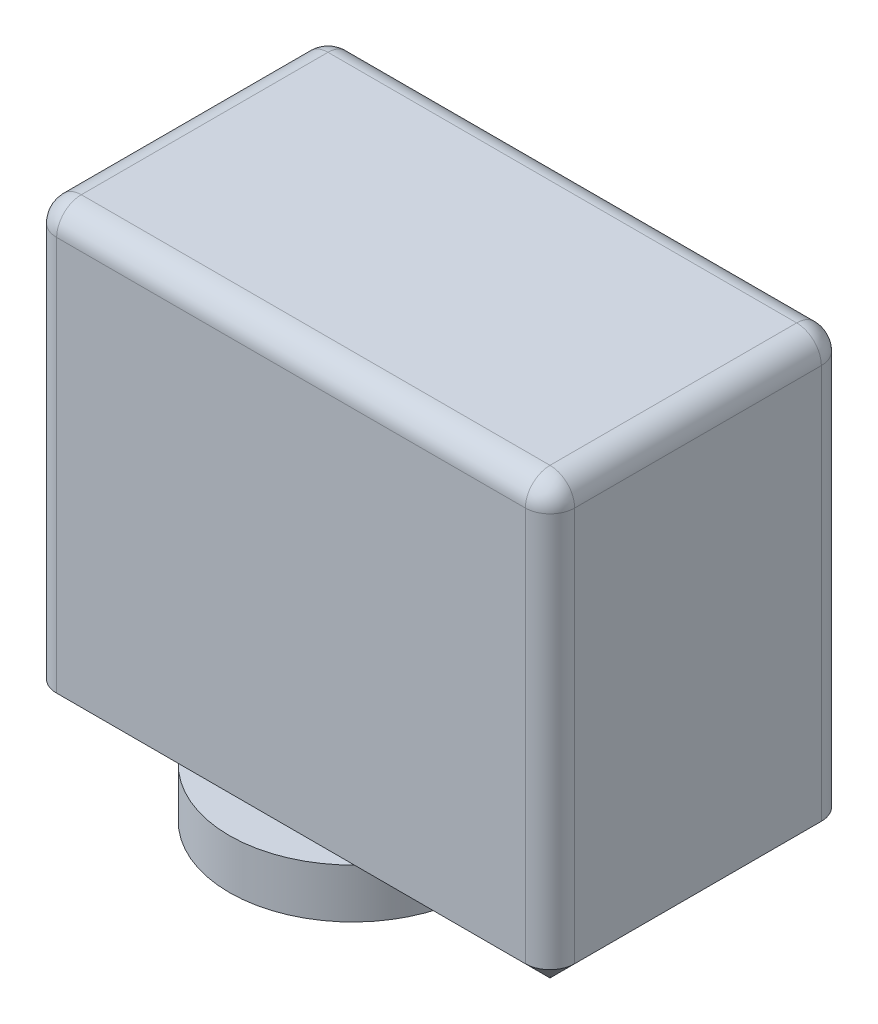
ISO-10303-21;
HEADER;
FILE_DESCRIPTION(('STEP AP214'),'2;1');
FILE_NAME('part.step','',(''),(''),'','','');
FILE_SCHEMA(('AUTOMOTIVE_DESIGN { 1 0 10303 214 1 1 1 1 }'));
ENDSEC;
DATA;
#1=APPLICATION_CONTEXT('core data for automotive mechanical design processes');
#2=APPLICATION_PROTOCOL_DEFINITION('international standard','automotive_design',2000,#1);
#3=PRODUCT_CONTEXT('',#1,'mechanical');
#4=PRODUCT('Part','Part','',(#3));
#5=PRODUCT_RELATED_PRODUCT_CATEGORY('part','',(#4));
#6=PRODUCT_DEFINITION_FORMATION('','',#4);
#7=PRODUCT_DEFINITION_CONTEXT('part definition',#1,'design');
#8=PRODUCT_DEFINITION('design','',#6,#7);
#9=PRODUCT_DEFINITION_SHAPE('','',#8);
#10=(LENGTH_UNIT() NAMED_UNIT(*) SI_UNIT(.MILLI.,.METRE.));
#11=(NAMED_UNIT(*) PLANE_ANGLE_UNIT() SI_UNIT($,.RADIAN.));
#12=(NAMED_UNIT(*) SI_UNIT($,.STERADIAN.) SOLID_ANGLE_UNIT());
#13=UNCERTAINTY_MEASURE_WITH_UNIT(LENGTH_MEASURE(1.E-05),#10,'distance_accuracy_value','');
#14=(GEOMETRIC_REPRESENTATION_CONTEXT(3) GLOBAL_UNCERTAINTY_ASSIGNED_CONTEXT((#13)) GLOBAL_UNIT_ASSIGNED_CONTEXT((#10,
#11,#12)) REPRESENTATION_CONTEXT('',''));
#15=CARTESIAN_POINT('',(0.,0.,0.));
#16=DIRECTION('',(0.,0.,1.));
#17=DIRECTION('',(1.,0.,0.));
#18=AXIS2_PLACEMENT_3D('',#15,#16,#17);
#19=CARTESIAN_POINT('',(-2.36981648973031,-5.11066723350098,0.));
#20=DIRECTION('',(0.,-1.,0.));
#21=DIRECTION('',(0.,0.,-1.));
#22=AXIS2_PLACEMENT_3D('',#19,#20,#21);
#23=CYLINDRICAL_SURFACE('',#22,8.51851851473251);
#24=CARTESIAN_POINT('',(-2.36981648973031,-5.11066723350098,0.));
#25=DIRECTION('',(0.,1.,0.));
#26=DIRECTION('',(0.,0.,1.));
#27=AXIS2_PLACEMENT_3D('',#24,#25,#26);
#28=CIRCLE('',#27,8.51851851473251);
#29=CARTESIAN_POINT('',(-2.36981648973031,-5.11066723350098,8.51851851473251));
#30=VERTEX_POINT('',#29);
#31=EDGE_CURVE('E566',#30,#30,#28,.T.);
#32=ORIENTED_EDGE('',*,*,#31,.F.);
#33=EDGE_LOOP('',(#32));
#34=FACE_BOUND('',#33,.T.);
#35=CARTESIAN_POINT('',(-2.36981648973031,-8.51807463939398,0.));
#36=DIRECTION('',(0.,1.,0.));
#37=DIRECTION('',(0.,0.,1.));
#38=AXIS2_PLACEMENT_3D('',#35,#36,#37);
#39=CIRCLE('',#38,8.51851851473251);
#40=CARTESIAN_POINT('',(-2.36981648973031,-8.51807463939398,8.51851851473251));
#41=VERTEX_POINT('',#40);
#42=EDGE_CURVE('E565',#41,#41,#39,.T.);
#43=ORIENTED_EDGE('',*,*,#42,.T.);
#44=EDGE_LOOP('',(#43));
#45=FACE_BOUND('',#44,.T.);
#46=ADVANCED_FACE('F40',(#34,#45),#23,.T.);
#47=CARTESIAN_POINT('',(-2.36981648973031,-5.11066723350098,0.));
#48=DIRECTION('',(0.,1.,0.));
#49=DIRECTION('',(0.,0.,1.));
#50=AXIS2_PLACEMENT_3D('',#47,#48,#49);
#51=PLANE('',#50);
#52=CARTESIAN_POINT('',(-2.36981648973031,-5.11066723350098,0.));
#53=DIRECTION('',(0.,1.,0.));
#54=DIRECTION('',(0.,0.,1.));
#55=AXIS2_PLACEMENT_3D('',#52,#53,#54);
#56=CIRCLE('',#55,3.407407405893);
#57=CARTESIAN_POINT('',(-2.36981648973031,-5.11066723350098,3.407407405893));
#58=VERTEX_POINT('',#57);
#59=EDGE_CURVE('E161',#58,#58,#56,.T.);
#60=ORIENTED_EDGE('',*,*,#59,.F.);
#61=EDGE_LOOP('',(#60));
#62=FACE_BOUND('',#61,.T.);
#63=ORIENTED_EDGE('',*,*,#31,.T.);
#64=EDGE_LOOP('',(#63));
#65=FACE_BOUND('',#64,.T.);
#66=ADVANCED_FACE('F320',(#62,#65),#51,.T.);
#67=CARTESIAN_POINT('',(-2.36981648973031,-8.51807463939398,0.));
#68=DIRECTION('',(0.,1.,0.));
#69=DIRECTION('',(0.,0.,1.));
#70=AXIS2_PLACEMENT_3D('',#67,#68,#69);
#71=PLANE('',#70);
#72=ORIENTED_EDGE('',*,*,#42,.F.);
#73=EDGE_LOOP('',(#72));
#74=FACE_BOUND('',#73,.T.);
#75=ADVANCED_FACE('F326',(#74),#71,.F.);
#76=CARTESIAN_POINT('',(-2.36981648973031,-2.55511167908123,0.));
#77=DIRECTION('',(0.,-1.,0.));
#78=DIRECTION('',(0.,0.,-1.));
#79=AXIS2_PLACEMENT_3D('',#76,#77,#78);
#80=CYLINDRICAL_SURFACE('',#79,3.407407405893);
#81=CARTESIAN_POINT('',(-2.36981648973031,-2.55511167908123,0.));
#82=DIRECTION('',(0.,1.,0.));
#83=DIRECTION('',(0.,0.,1.));
#84=AXIS2_PLACEMENT_3D('',#81,#82,#83);
#85=CIRCLE('',#84,3.407407405893);
#86=CARTESIAN_POINT('',(-2.36981648973031,-2.55511167908123,3.407407405893));
#87=VERTEX_POINT('',#86);
#88=EDGE_CURVE('E221',#87,#87,#85,.T.);
#89=ORIENTED_EDGE('',*,*,#88,.F.);
#90=EDGE_LOOP('',(#89));
#91=FACE_BOUND('',#90,.T.);
#92=ORIENTED_EDGE('',*,*,#59,.T.);
#93=EDGE_LOOP('',(#92));
#94=FACE_BOUND('',#93,.T.);
#95=ADVANCED_FACE('F532',(#91,#94),#80,.T.);
#96=CARTESIAN_POINT('',(21.4820353515207,28.1115549739558,10.222222217679));
#97=DIRECTION('',(-1.,0.,0.));
#98=DIRECTION('',(0.,0.,1.));
#99=AXIS2_PLACEMENT_3D('',#96,#97,#98);
#100=PLANE('',#99);
#101=DIRECTION('',(0.,-1.,0.));
#102=VECTOR('',#101,1.);
#103=CARTESIAN_POINT('',(21.4820353515207,28.1115549739558,8.51851851473251));
#104=LINE('',#103,#102);
#105=CARTESIAN_POINT('',(21.4820353515207,26.4078512710093,8.51851851473251));
#106=VERTEX_POINT('',#105);
#107=CARTESIAN_POINT('',(21.4820353515207,-0.851407976134718,8.51851851473251));
#108=VERTEX_POINT('',#107);
#109=EDGE_CURVE('E187',#106,#108,#104,.T.);
#110=ORIENTED_EDGE('',*,*,#109,.T.);
#111=DIRECTION('',(0.,0.,-1.));
#112=VECTOR('',#111,1.);
#113=CARTESIAN_POINT('',(21.4820353515207,-0.851407976134718,10.222222217679));
#114=LINE('',#113,#112);
#115=CARTESIAN_POINT('',(21.4820353515207,-0.851407976134718,-8.51851851473251));
#116=VERTEX_POINT('',#115);
#117=EDGE_CURVE('E237',#108,#116,#114,.T.);
#118=ORIENTED_EDGE('',*,*,#117,.T.);
#119=DIRECTION('',(0.,-1.,0.));
#120=VECTOR('',#119,1.);
#121=CARTESIAN_POINT('',(21.4820353515207,28.1115549739558,-8.51851851473251));
#122=LINE('',#121,#120);
#123=CARTESIAN_POINT('',(21.4820353515207,26.4078512710093,-8.51851851473251));
#124=VERTEX_POINT('',#123);
#125=EDGE_CURVE('E183',#116,#124,#122,.F.);
#126=ORIENTED_EDGE('',*,*,#125,.T.);
#127=DIRECTION('',(0.,0.,-1.));
#128=VECTOR('',#127,1.);
#129=CARTESIAN_POINT('',(21.4820353515207,26.4078512710093,10.222222217679));
#130=LINE('',#129,#128);
#131=EDGE_CURVE('E185',#124,#106,#130,.F.);
#132=ORIENTED_EDGE('',*,*,#131,.T.);
#133=EDGE_LOOP('',(#110,#118,#126,#132));
#134=FACE_BOUND('',#133,.T.);
#135=ADVANCED_FACE('F306',(#134),#100,.F.);
#136=CARTESIAN_POINT('',(-2.36981648973031,28.1115549739558,-10.222222217679));
#137=DIRECTION('',(0.,0.,1.));
#138=DIRECTION('',(1.,0.,0.));
#139=AXIS2_PLACEMENT_3D('',#136,#137,#138);
#140=PLANE('',#139);
#141=DIRECTION('',(0.,-1.,0.));
#142=VECTOR('',#141,1.);
#143=CARTESIAN_POINT('',(19.7783316485742,28.1115549739558,-10.222222217679));
#144=LINE('',#143,#142);
#145=CARTESIAN_POINT('',(19.7783316485742,26.4078512710093,-10.222222217679));
#146=VERTEX_POINT('',#145);
#147=CARTESIAN_POINT('',(19.7783316485742,-0.851407976134718,-10.222222217679));
#148=VERTEX_POINT('',#147);
#149=EDGE_CURVE('E181',#146,#148,#144,.T.);
#150=ORIENTED_EDGE('',*,*,#149,.T.);
#151=DIRECTION('',(-1.,0.,0.));
#152=VECTOR('',#151,1.);
#153=CARTESIAN_POINT('',(-2.36981648973031,-0.851407976134718,-10.222222217679));
#154=LINE('',#153,#152);
#155=CARTESIAN_POINT('',(-12.5920387074093,-0.851407976134718,-10.222222217679));
#156=VERTEX_POINT('',#155);
#157=EDGE_CURVE('E11',#148,#156,#154,.T.);
#158=ORIENTED_EDGE('',*,*,#157,.T.);
#159=DIRECTION('',(0.,-1.,0.));
#160=VECTOR('',#159,1.);
#161=CARTESIAN_POINT('',(-12.5920387074093,28.1115549739558,-10.222222217679));
#162=LINE('',#161,#160);
#163=CARTESIAN_POINT('',(-12.5920387074093,26.4078512710093,-10.222222217679));
#164=VERTEX_POINT('',#163);
#165=EDGE_CURVE('E177',#156,#164,#162,.F.);
#166=ORIENTED_EDGE('',*,*,#165,.T.);
#167=DIRECTION('',(-1.,0.,0.));
#168=VECTOR('',#167,1.);
#169=CARTESIAN_POINT('',(21.4820353515207,26.4078512710093,-10.222222217679));
#170=LINE('',#169,#168);
#171=EDGE_CURVE('E179',#164,#146,#170,.F.);
#172=ORIENTED_EDGE('',*,*,#171,.T.);
#173=EDGE_LOOP('',(#150,#158,#166,#172));
#174=FACE_BOUND('',#173,.T.);
#175=ADVANCED_FACE('F514',(#174),#140,.F.);
#176=CARTESIAN_POINT('',(-14.2957424103558,28.1115549739558,-10.222222217679));
#177=DIRECTION('',(1.,0.,0.));
#178=DIRECTION('',(0.,0.,-1.));
#179=AXIS2_PLACEMENT_3D('',#176,#177,#178);
#180=PLANE('',#179);
#181=DIRECTION('',(0.,-1.,0.));
#182=VECTOR('',#181,1.);
#183=CARTESIAN_POINT('',(-14.2957424103558,28.1115549739558,-8.51851851473251));
#184=LINE('',#183,#182);
#185=CARTESIAN_POINT('',(-14.2957424103558,26.4078512710093,-8.51851851473251));
#186=VERTEX_POINT('',#185);
#187=CARTESIAN_POINT('',(-14.2957424103558,-0.851407976134718,-8.51851851473251));
#188=VERTEX_POINT('',#187);
#189=EDGE_CURVE('E167',#186,#188,#184,.T.);
#190=ORIENTED_EDGE('',*,*,#189,.T.);
#191=DIRECTION('',(0.,0.,1.));
#192=VECTOR('',#191,1.);
#193=CARTESIAN_POINT('',(-14.2957424103558,-0.851407976134718,-10.222222217679));
#194=LINE('',#193,#192);
#195=CARTESIAN_POINT('',(-14.2957424103558,-0.851407976134718,8.51851851473251));
#196=VERTEX_POINT('',#195);
#197=EDGE_CURVE('E239',#188,#196,#194,.T.);
#198=ORIENTED_EDGE('',*,*,#197,.T.);
#199=DIRECTION('',(0.,-1.,0.));
#200=VECTOR('',#199,1.);
#201=CARTESIAN_POINT('',(-14.2957424103558,28.1115549739558,8.51851851473251));
#202=LINE('',#201,#200);
#203=CARTESIAN_POINT('',(-14.2957424103558,26.4078512710093,8.51851851473251));
#204=VERTEX_POINT('',#203);
#205=EDGE_CURVE('E175',#196,#204,#202,.F.);
#206=ORIENTED_EDGE('',*,*,#205,.T.);
#207=DIRECTION('',(0.,0.,1.));
#208=VECTOR('',#207,1.);
#209=CARTESIAN_POINT('',(-14.2957424103558,26.4078512710093,-10.222222217679));
#210=LINE('',#209,#208);
#211=EDGE_CURVE('E138',#204,#186,#210,.F.);
#212=ORIENTED_EDGE('',*,*,#211,.T.);
#213=EDGE_LOOP('',(#190,#198,#206,#212));
#214=FACE_BOUND('',#213,.T.);
#215=ADVANCED_FACE('F279',(#214),#180,.F.);
#216=CARTESIAN_POINT('',(-2.36981648973031,28.1115549739558,10.222222217679));
#217=DIRECTION('',(0.,0.,-1.));
#218=DIRECTION('',(-1.,0.,0.));
#219=AXIS2_PLACEMENT_3D('',#216,#217,#218);
#220=PLANE('',#219);
#221=DIRECTION('',(0.,-1.,0.));
#222=VECTOR('',#221,1.);
#223=CARTESIAN_POINT('',(-12.5920387074093,28.1115549739558,10.222222217679));
#224=LINE('',#223,#222);
#225=CARTESIAN_POINT('',(-12.5920387074093,26.4078512710093,10.222222217679));
#226=VERTEX_POINT('',#225);
#227=CARTESIAN_POINT('',(-12.5920387074093,-0.851407976134718,10.222222217679));
#228=VERTEX_POINT('',#227);
#229=EDGE_CURVE('E190',#226,#228,#224,.T.);
#230=ORIENTED_EDGE('',*,*,#229,.T.);
#231=DIRECTION('',(1.,0.,0.));
#232=VECTOR('',#231,1.);
#233=CARTESIAN_POINT('',(-2.36981648973031,-0.851407976134718,10.222222217679));
#234=LINE('',#233,#232);
#235=CARTESIAN_POINT('',(19.7783316485742,-0.851407976134718,10.222222217679));
#236=VERTEX_POINT('',#235);
#237=EDGE_CURVE('E196',#228,#236,#234,.T.);
#238=ORIENTED_EDGE('',*,*,#237,.T.);
#239=DIRECTION('',(0.,-1.,0.));
#240=VECTOR('',#239,1.);
#241=CARTESIAN_POINT('',(19.7783316485742,28.1115549739558,10.222222217679));
#242=LINE('',#241,#240);
#243=CARTESIAN_POINT('',(19.7783316485742,26.4078512710093,10.222222217679));
#244=VERTEX_POINT('',#243);
#245=EDGE_CURVE('E195',#236,#244,#242,.F.);
#246=ORIENTED_EDGE('',*,*,#245,.T.);
#247=DIRECTION('',(1.,0.,0.));
#248=VECTOR('',#247,1.);
#249=CARTESIAN_POINT('',(-14.2957424103558,26.4078512710093,10.222222217679));
#250=LINE('',#249,#248);
#251=EDGE_CURVE('E193',#244,#226,#250,.F.);
#252=ORIENTED_EDGE('',*,*,#251,.T.);
#253=EDGE_LOOP('',(#230,#238,#246,#252));
#254=FACE_BOUND('',#253,.T.);
#255=ADVANCED_FACE('F286',(#254),#220,.F.);
#256=CARTESIAN_POINT('',(-2.36981648973031,28.1115549739558,0.));
#257=DIRECTION('',(0.,1.,0.));
#258=DIRECTION('',(0.,0.,1.));
#259=AXIS2_PLACEMENT_3D('',#256,#257,#258);
#260=PLANE('',#259);
#261=DIRECTION('',(-1.,0.,0.));
#262=VECTOR('',#261,1.);
#263=CARTESIAN_POINT('',(-14.2957424103558,28.1115549739558,-8.51851851473251));
#264=LINE('',#263,#262);
#265=CARTESIAN_POINT('',(19.7783316485742,28.1115549739558,-8.51851851473251));
#266=VERTEX_POINT('',#265);
#267=CARTESIAN_POINT('',(-12.5920387074093,28.1115549739558,-8.51851851473251));
#268=VERTEX_POINT('',#267);
#269=EDGE_CURVE('E165',#266,#268,#264,.T.);
#270=ORIENTED_EDGE('',*,*,#269,.T.);
#271=DIRECTION('',(0.,0.,1.));
#272=VECTOR('',#271,1.);
#273=CARTESIAN_POINT('',(-12.5920387074093,28.1115549739558,10.222222217679));
#274=LINE('',#273,#272);
#275=CARTESIAN_POINT('',(-12.5920387074093,28.1115549739558,8.51851851473251));
#276=VERTEX_POINT('',#275);
#277=EDGE_CURVE('E136',#268,#276,#274,.T.);
#278=ORIENTED_EDGE('',*,*,#277,.T.);
#279=DIRECTION('',(1.,0.,0.));
#280=VECTOR('',#279,1.);
#281=CARTESIAN_POINT('',(21.4820353515207,28.1115549739558,8.51851851473251));
#282=LINE('',#281,#280);
#283=CARTESIAN_POINT('',(19.7783316485742,28.1115549739558,8.51851851473251));
#284=VERTEX_POINT('',#283);
#285=EDGE_CURVE('E154',#276,#284,#282,.T.);
#286=ORIENTED_EDGE('',*,*,#285,.T.);
#287=DIRECTION('',(0.,0.,-1.));
#288=VECTOR('',#287,1.);
#289=CARTESIAN_POINT('',(19.7783316485742,28.1115549739558,-10.222222217679));
#290=LINE('',#289,#288);
#291=EDGE_CURVE('E160',#284,#266,#290,.T.);
#292=ORIENTED_EDGE('',*,*,#291,.T.);
#293=EDGE_LOOP('',(#270,#278,#286,#292));
#294=FACE_BOUND('',#293,.T.);
#295=ADVANCED_FACE('F163',(#294),#260,.T.);
#296=CARTESIAN_POINT('',(-2.36981648973031,-2.55511167908123,0.));
#297=DIRECTION('',(0.,1.,0.));
#298=DIRECTION('',(0.,0.,1.));
#299=AXIS2_PLACEMENT_3D('',#296,#297,#298);
#300=PLANE('',#299);
#301=DIRECTION('',(0.,0.,1.));
#302=VECTOR('',#301,1.);
#303=CARTESIAN_POINT('',(19.7783316485742,-2.55511167908123,0.));
#304=LINE('',#303,#302);
#305=CARTESIAN_POINT('',(19.7783316485742,-2.55511167908123,-8.51851851473249));
#306=VERTEX_POINT('',#305);
#307=CARTESIAN_POINT('',(19.7783316485742,-2.55511167908123,8.51851851473251));
#308=VERTEX_POINT('',#307);
#309=EDGE_CURVE('E228',#306,#308,#304,.T.);
#310=ORIENTED_EDGE('',*,*,#309,.T.);
#311=DIRECTION('',(-1.,0.,0.));
#312=VECTOR('',#311,1.);
#313=CARTESIAN_POINT('',(-2.36981648973031,-2.55511167908123,8.51851851473249));
#314=LINE('',#313,#312);
#315=CARTESIAN_POINT('',(-12.5920387074093,-2.55511167908123,8.51851851473251));
#316=VERTEX_POINT('',#315);
#317=EDGE_CURVE('E230',#308,#316,#314,.T.);
#318=ORIENTED_EDGE('',*,*,#317,.T.);
#319=DIRECTION('',(0.,0.,-1.));
#320=VECTOR('',#319,1.);
#321=CARTESIAN_POINT('',(-12.5920387074093,-2.55511167908123,0.));
#322=LINE('',#321,#320);
#323=CARTESIAN_POINT('',(-12.5920387074093,-2.55511167908123,-8.51851851473249));
#324=VERTEX_POINT('',#323);
#325=EDGE_CURVE('E226',#316,#324,#322,.T.);
#326=ORIENTED_EDGE('',*,*,#325,.T.);
#327=DIRECTION('',(1.,0.,0.));
#328=VECTOR('',#327,1.);
#329=CARTESIAN_POINT('',(-2.36981648973031,-2.55511167908123,-8.51851851473249));
#330=LINE('',#329,#328);
#331=EDGE_CURVE('E224',#324,#306,#330,.T.);
#332=ORIENTED_EDGE('',*,*,#331,.T.);
#333=EDGE_LOOP('',(#310,#318,#326,#332));
#334=FACE_BOUND('',#333,.T.);
#335=ORIENTED_EDGE('',*,*,#88,.T.);
#336=EDGE_LOOP('',(#335));
#337=FACE_BOUND('',#336,.T.);
#338=ADVANCED_FACE('F370',(#334,#337),#300,.F.);
#339=CARTESIAN_POINT('',(19.7783316485742,28.1115549739558,-8.51851851473251));
#340=DIRECTION('',(0.,-1.,0.));
#341=DIRECTION('',(0.,0.,-1.));
#342=AXIS2_PLACEMENT_3D('',#339,#340,#341);
#343=CYLINDRICAL_SURFACE('',#342,1.7037037029465);
#344=ORIENTED_EDGE('',*,*,#125,.F.);
#345=CARTESIAN_POINT('',(19.7783316485742,-0.851407976134718,-8.51851851473251));
#346=DIRECTION('',(0.,1.,0.));
#347=DIRECTION('',(0.,0.,1.));
#348=AXIS2_PLACEMENT_3D('',#345,#346,#347);
#349=CIRCLE('',#348,1.7037037029465);
#350=EDGE_CURVE('E63',#116,#148,#349,.T.);
#351=ORIENTED_EDGE('',*,*,#350,.T.);
#352=ORIENTED_EDGE('',*,*,#149,.F.);
#353=CARTESIAN_POINT('',(19.7783316485742,26.4078512710093,-8.51851851473251));
#354=DIRECTION('',(0.,1.,0.));
#355=DIRECTION('',(0.,0.,1.));
#356=AXIS2_PLACEMENT_3D('',#353,#354,#355);
#357=CIRCLE('',#356,1.7037037029465);
#358=EDGE_CURVE('E218',#124,#146,#357,.T.);
#359=ORIENTED_EDGE('',*,*,#358,.F.);
#360=EDGE_LOOP('',(#344,#351,#352,#359));
#361=FACE_BOUND('',#360,.T.);
#362=ADVANCED_FACE('F366',(#361),#343,.T.);
#363=CARTESIAN_POINT('',(19.7783316485742,26.4078512710093,0.));
#364=DIRECTION('',(0.,0.,1.));
#365=DIRECTION('',(1.,0.,0.));
#366=AXIS2_PLACEMENT_3D('',#363,#364,#365);
#367=CYLINDRICAL_SURFACE('',#366,1.7037037029465);
#368=CARTESIAN_POINT('',(19.7783316485742,26.4078512710093,8.51851851473251));
#369=DIRECTION('',(0.,0.,1.));
#370=DIRECTION('',(1.,0.,0.));
#371=AXIS2_PLACEMENT_3D('',#368,#369,#370);
#372=CIRCLE('',#371,1.7037037029465);
#373=EDGE_CURVE('E212',#106,#284,#372,.T.);
#374=ORIENTED_EDGE('',*,*,#373,.F.);
#375=ORIENTED_EDGE('',*,*,#131,.F.);
#376=CARTESIAN_POINT('',(19.7783316485742,26.4078512710093,-8.51851851473251));
#377=DIRECTION('',(0.,0.,-1.));
#378=DIRECTION('',(-1.,0.,0.));
#379=AXIS2_PLACEMENT_3D('',#376,#377,#378);
#380=CIRCLE('',#379,1.7037037029465);
#381=EDGE_CURVE('E215',#266,#124,#380,.T.);
#382=ORIENTED_EDGE('',*,*,#381,.F.);
#383=ORIENTED_EDGE('',*,*,#291,.F.);
#384=EDGE_LOOP('',(#374,#375,#382,#383));
#385=FACE_BOUND('',#384,.T.);
#386=ADVANCED_FACE('F363',(#385),#367,.T.);
#387=CARTESIAN_POINT('',(19.7783316485742,28.1115549739558,8.51851851473251));
#388=DIRECTION('',(0.,-1.,0.));
#389=DIRECTION('',(0.,0.,-1.));
#390=AXIS2_PLACEMENT_3D('',#387,#388,#389);
#391=CYLINDRICAL_SURFACE('',#390,1.7037037029465);
#392=ORIENTED_EDGE('',*,*,#245,.F.);
#393=CARTESIAN_POINT('',(19.7783316485742,-0.851407976134718,8.51851851473251));
#394=DIRECTION('',(0.,1.,0.));
#395=DIRECTION('',(0.,0.,1.));
#396=AXIS2_PLACEMENT_3D('',#393,#394,#395);
#397=CIRCLE('',#396,1.7037037029465);
#398=EDGE_CURVE('E233',#236,#108,#397,.T.);
#399=ORIENTED_EDGE('',*,*,#398,.T.);
#400=ORIENTED_EDGE('',*,*,#109,.F.);
#401=CARTESIAN_POINT('',(19.7783316485742,26.4078512710093,8.51851851473251));
#402=DIRECTION('',(0.,1.,0.));
#403=DIRECTION('',(0.,0.,1.));
#404=AXIS2_PLACEMENT_3D('',#401,#402,#403);
#405=CIRCLE('',#404,1.7037037029465);
#406=EDGE_CURVE('E209',#244,#106,#405,.T.);
#407=ORIENTED_EDGE('',*,*,#406,.F.);
#408=EDGE_LOOP('',(#392,#399,#400,#407));
#409=FACE_BOUND('',#408,.T.);
#410=ADVANCED_FACE('F301',(#409),#391,.T.);
#411=CARTESIAN_POINT('',(19.7783316485742,26.4078512710093,-8.51851851473251));
#412=DIRECTION('',(0.,0.,1.));
#413=DIRECTION('',(1.,0.,0.));
#414=AXIS2_PLACEMENT_3D('',#411,#412,#413);
#415=SPHERICAL_SURFACE('',#414,1.7037037029465);
#416=ORIENTED_EDGE('',*,*,#381,.T.);
#417=ORIENTED_EDGE('',*,*,#358,.T.);
#418=CARTESIAN_POINT('',(19.7783316485742,26.4078512710093,-8.51851851473251));
#419=DIRECTION('',(1.,0.,0.));
#420=DIRECTION('',(0.,0.,-1.));
#421=AXIS2_PLACEMENT_3D('',#418,#419,#420);
#422=CIRCLE('',#421,1.7037037029465);
#423=EDGE_CURVE('E206',#266,#146,#422,.F.);
#424=ORIENTED_EDGE('',*,*,#423,.F.);
#425=EDGE_LOOP('',(#416,#417,#424));
#426=FACE_BOUND('',#425,.T.);
#427=ADVANCED_FACE('F356',(#426),#415,.T.);
#428=CARTESIAN_POINT('',(19.7783316485742,26.4078512710093,8.51851851473251));
#429=DIRECTION('',(0.,0.,1.));
#430=DIRECTION('',(1.,0.,0.));
#431=AXIS2_PLACEMENT_3D('',#428,#429,#430);
#432=SPHERICAL_SURFACE('',#431,1.7037037029465);
#433=ORIENTED_EDGE('',*,*,#406,.T.);
#434=ORIENTED_EDGE('',*,*,#373,.T.);
#435=CARTESIAN_POINT('',(19.7783316485742,26.4078512710093,8.51851851473251));
#436=DIRECTION('',(1.,0.,0.));
#437=DIRECTION('',(0.,0.,-1.));
#438=AXIS2_PLACEMENT_3D('',#435,#436,#437);
#439=CIRCLE('',#438,1.7037037029465);
#440=EDGE_CURVE('E157',#244,#284,#439,.F.);
#441=ORIENTED_EDGE('',*,*,#440,.F.);
#442=EDGE_LOOP('',(#433,#434,#441));
#443=FACE_BOUND('',#442,.T.);
#444=ADVANCED_FACE('F352',(#443),#432,.T.);
#445=CARTESIAN_POINT('',(-12.5920387074093,28.1115549739558,-8.51851851473251));
#446=DIRECTION('',(0.,-1.,0.));
#447=DIRECTION('',(0.,0.,-1.));
#448=AXIS2_PLACEMENT_3D('',#445,#446,#447);
#449=CYLINDRICAL_SURFACE('',#448,1.7037037029465);
#450=ORIENTED_EDGE('',*,*,#165,.F.);
#451=CARTESIAN_POINT('',(-12.5920387074093,-0.851407976134718,-8.51851851473251));
#452=DIRECTION('',(0.,1.,0.));
#453=DIRECTION('',(0.,0.,1.));
#454=AXIS2_PLACEMENT_3D('',#451,#452,#453);
#455=CIRCLE('',#454,1.7037037029465);
#456=EDGE_CURVE('E49',#156,#188,#455,.T.);
#457=ORIENTED_EDGE('',*,*,#456,.T.);
#458=ORIENTED_EDGE('',*,*,#189,.F.);
#459=CARTESIAN_POINT('',(-12.5920387074093,26.4078512710093,-8.51851851473251));
#460=DIRECTION('',(0.,1.,0.));
#461=DIRECTION('',(0.,0.,1.));
#462=AXIS2_PLACEMENT_3D('',#459,#460,#461);
#463=CIRCLE('',#462,1.7037037029465);
#464=EDGE_CURVE('E202',#164,#186,#463,.T.);
#465=ORIENTED_EDGE('',*,*,#464,.F.);
#466=EDGE_LOOP('',(#450,#457,#458,#465));
#467=FACE_BOUND('',#466,.T.);
#468=ADVANCED_FACE('F348',(#467),#449,.T.);
#469=CARTESIAN_POINT('',(-2.36981648973031,26.4078512710093,-8.51851851473251));
#470=DIRECTION('',(1.,0.,0.));
#471=DIRECTION('',(0.,0.,-1.));
#472=AXIS2_PLACEMENT_3D('',#469,#470,#471);
#473=CYLINDRICAL_SURFACE('',#472,1.7037037029465);
#474=ORIENTED_EDGE('',*,*,#423,.T.);
#475=ORIENTED_EDGE('',*,*,#171,.F.);
#476=CARTESIAN_POINT('',(-12.5920387074093,26.4078512710093,-8.51851851473251));
#477=DIRECTION('',(-1.,0.,0.));
#478=DIRECTION('',(0.,0.,1.));
#479=AXIS2_PLACEMENT_3D('',#476,#477,#478);
#480=CIRCLE('',#479,1.7037037029465);
#481=EDGE_CURVE('E151',#268,#164,#480,.T.);
#482=ORIENTED_EDGE('',*,*,#481,.F.);
#483=ORIENTED_EDGE('',*,*,#269,.F.);
#484=EDGE_LOOP('',(#474,#475,#482,#483));
#485=FACE_BOUND('',#484,.T.);
#486=ADVANCED_FACE('F345',(#485),#473,.T.);
#487=CARTESIAN_POINT('',(-2.36981648973031,26.4078512710093,8.51851851473251));
#488=DIRECTION('',(-1.,0.,0.));
#489=DIRECTION('',(0.,0.,1.));
#490=AXIS2_PLACEMENT_3D('',#487,#488,#489);
#491=CYLINDRICAL_SURFACE('',#490,1.7037037029465);
#492=ORIENTED_EDGE('',*,*,#440,.T.);
#493=ORIENTED_EDGE('',*,*,#285,.F.);
#494=CARTESIAN_POINT('',(-12.5920387074093,26.4078512710093,8.51851851473251));
#495=DIRECTION('',(-1.,0.,0.));
#496=DIRECTION('',(0.,0.,1.));
#497=AXIS2_PLACEMENT_3D('',#494,#495,#496);
#498=CIRCLE('',#497,1.7037037029465);
#499=EDGE_CURVE('E144',#226,#276,#498,.T.);
#500=ORIENTED_EDGE('',*,*,#499,.F.);
#501=ORIENTED_EDGE('',*,*,#251,.F.);
#502=EDGE_LOOP('',(#492,#493,#500,#501));
#503=FACE_BOUND('',#502,.T.);
#504=ADVANCED_FACE('F155',(#503),#491,.T.);
#505=CARTESIAN_POINT('',(-12.5920387074093,28.1115549739558,8.51851851473251));
#506=DIRECTION('',(0.,-1.,0.));
#507=DIRECTION('',(0.,0.,-1.));
#508=AXIS2_PLACEMENT_3D('',#505,#506,#507);
#509=CYLINDRICAL_SURFACE('',#508,1.7037037029465);
#510=ORIENTED_EDGE('',*,*,#205,.F.);
#511=CARTESIAN_POINT('',(-12.5920387074093,-0.851407976134718,8.51851851473251));
#512=DIRECTION('',(0.,1.,0.));
#513=DIRECTION('',(0.,0.,1.));
#514=AXIS2_PLACEMENT_3D('',#511,#512,#513);
#515=CIRCLE('',#514,1.7037037029465);
#516=EDGE_CURVE('E235',#196,#228,#515,.T.);
#517=ORIENTED_EDGE('',*,*,#516,.T.);
#518=ORIENTED_EDGE('',*,*,#229,.F.);
#519=CARTESIAN_POINT('',(-12.5920387074093,26.4078512710093,8.51851851473251));
#520=DIRECTION('',(0.,1.,0.));
#521=DIRECTION('',(0.,0.,1.));
#522=AXIS2_PLACEMENT_3D('',#519,#520,#521);
#523=CIRCLE('',#522,1.7037037029465);
#524=EDGE_CURVE('E148',#204,#226,#523,.T.);
#525=ORIENTED_EDGE('',*,*,#524,.F.);
#526=EDGE_LOOP('',(#510,#517,#518,#525));
#527=FACE_BOUND('',#526,.T.);
#528=ADVANCED_FACE('F282',(#527),#509,.T.);
#529=CARTESIAN_POINT('',(-12.5920387074093,26.4078512710093,-8.51851851473251));
#530=DIRECTION('',(0.,0.,1.));
#531=DIRECTION('',(1.,0.,0.));
#532=AXIS2_PLACEMENT_3D('',#529,#530,#531);
#533=SPHERICAL_SURFACE('',#532,1.7037037029465);
#534=ORIENTED_EDGE('',*,*,#481,.T.);
#535=ORIENTED_EDGE('',*,*,#464,.T.);
#536=CARTESIAN_POINT('',(-12.5920387074093,26.4078512710093,-8.51851851473251));
#537=DIRECTION('',(0.,0.,-1.));
#538=DIRECTION('',(-1.,0.,0.));
#539=AXIS2_PLACEMENT_3D('',#536,#537,#538);
#540=CIRCLE('',#539,1.7037037029465);
#541=EDGE_CURVE('E141',#268,#186,#540,.F.);
#542=ORIENTED_EDGE('',*,*,#541,.F.);
#543=EDGE_LOOP('',(#534,#535,#542));
#544=FACE_BOUND('',#543,.T.);
#545=ADVANCED_FACE('F337',(#544),#533,.T.);
#546=CARTESIAN_POINT('',(-12.5920387074093,26.4078512710093,8.51851851473251));
#547=DIRECTION('',(0.,0.,1.));
#548=DIRECTION('',(1.,0.,0.));
#549=AXIS2_PLACEMENT_3D('',#546,#547,#548);
#550=SPHERICAL_SURFACE('',#549,1.7037037029465);
#551=ORIENTED_EDGE('',*,*,#524,.T.);
#552=ORIENTED_EDGE('',*,*,#499,.T.);
#553=CARTESIAN_POINT('',(-12.5920387074093,26.4078512710093,8.51851851473251));
#554=DIRECTION('',(0.,0.,1.));
#555=DIRECTION('',(1.,0.,0.));
#556=AXIS2_PLACEMENT_3D('',#553,#554,#555);
#557=CIRCLE('',#556,1.7037037029465);
#558=EDGE_CURVE('E132',#204,#276,#557,.F.);
#559=ORIENTED_EDGE('',*,*,#558,.F.);
#560=EDGE_LOOP('',(#551,#552,#559));
#561=FACE_BOUND('',#560,.T.);
#562=ADVANCED_FACE('F146',(#561),#550,.T.);
#563=CARTESIAN_POINT('',(-12.5920387074093,26.4078512710093,0.));
#564=DIRECTION('',(0.,0.,-1.));
#565=DIRECTION('',(-1.,0.,0.));
#566=AXIS2_PLACEMENT_3D('',#563,#564,#565);
#567=CYLINDRICAL_SURFACE('',#566,1.7037037029465);
#568=ORIENTED_EDGE('',*,*,#541,.T.);
#569=ORIENTED_EDGE('',*,*,#211,.F.);
#570=ORIENTED_EDGE('',*,*,#558,.T.);
#571=ORIENTED_EDGE('',*,*,#277,.F.);
#572=EDGE_LOOP('',(#568,#569,#570,#571));
#573=FACE_BOUND('',#572,.T.);
#574=ADVANCED_FACE('F134',(#573),#567,.T.);
#575=CARTESIAN_POINT('',(-2.36981648973031,-0.851407976134718,-10.222222217679));
#576=DIRECTION('',(0.,0.70710678118655,0.707106781186545));
#577=DIRECTION('',(-1.,0.,0.));
#578=AXIS2_PLACEMENT_3D('',#575,#576,#577);
#579=PLANE('',#578);
#580=DIRECTION('',(0.,-0.707106781186545,0.70710678118655));
#581=VECTOR('',#580,1.);
#582=CARTESIAN_POINT('',(-12.5920387074093,-0.851407976134718,-10.222222217679));
#583=LINE('',#582,#581);
#584=EDGE_CURVE('E44',#156,#324,#583,.T.);
#585=ORIENTED_EDGE('',*,*,#584,.F.);
#586=ORIENTED_EDGE('',*,*,#157,.F.);
#587=DIRECTION('',(0.,0.707106781186545,-0.70710678118655));
#588=VECTOR('',#587,1.);
#589=CARTESIAN_POINT('',(19.7783316485742,-2.55511167908123,-8.51851851473249));
#590=LINE('',#589,#588);
#591=EDGE_CURVE('E258',#306,#148,#590,.T.);
#592=ORIENTED_EDGE('',*,*,#591,.F.);
#593=ORIENTED_EDGE('',*,*,#331,.F.);
#594=EDGE_LOOP('',(#585,#586,#592,#593));
#595=FACE_BOUND('',#594,.T.);
#596=ADVANCED_FACE('F42',(#595),#579,.F.);
#597=CARTESIAN_POINT('',(-12.5920387074093,-0.851407976134718,-8.51851851473251));
#598=DIRECTION('',(0.,1.,0.));
#599=DIRECTION('',(0.,0.,1.));
#600=AXIS2_PLACEMENT_3D('',#597,#598,#599);
#601=CONICAL_SURFACE('',#600,1.70370370294652,0.785398163397452);
#602=ORIENTED_EDGE('',*,*,#456,.F.);
#603=ORIENTED_EDGE('',*,*,#584,.T.);
#604=DIRECTION('',(0.70710678118655,-0.707106781186545,0.));
#605=VECTOR('',#604,1.);
#606=CARTESIAN_POINT('',(-14.2957424103558,-0.851407976134718,-8.51851851473251));
#607=LINE('',#606,#605);
#608=EDGE_CURVE('E256',#188,#324,#607,.T.);
#609=ORIENTED_EDGE('',*,*,#608,.F.);
#610=EDGE_LOOP('',(#602,#603,#609));
#611=FACE_BOUND('',#610,.T.);
#612=ADVANCED_FACE('F268',(#611),#601,.T.);
#613=CARTESIAN_POINT('',(19.7783316485742,-0.851407976134718,-8.51851851473251));
#614=DIRECTION('',(0.,1.,0.));
#615=DIRECTION('',(0.,0.,1.));
#616=AXIS2_PLACEMENT_3D('',#613,#614,#615);
#617=CONICAL_SURFACE('',#616,1.70370370294652,0.785398163397452);
#618=ORIENTED_EDGE('',*,*,#591,.T.);
#619=ORIENTED_EDGE('',*,*,#350,.F.);
#620=DIRECTION('',(0.70710678118655,0.707106781186545,0.));
#621=VECTOR('',#620,1.);
#622=CARTESIAN_POINT('',(19.7783316485742,-2.55511167908123,-8.51851851473251));
#623=LINE('',#622,#621);
#624=EDGE_CURVE('E253',#306,#116,#623,.T.);
#625=ORIENTED_EDGE('',*,*,#624,.F.);
#626=EDGE_LOOP('',(#618,#619,#625));
#627=FACE_BOUND('',#626,.T.);
#628=ADVANCED_FACE('F311',(#627),#617,.T.);
#629=CARTESIAN_POINT('',(-14.2957424103558,-0.851407976134718,-10.222222217679));
#630=DIRECTION('',(0.707106781186545,0.70710678118655,0.));
#631=DIRECTION('',(0.,0.,1.));
#632=AXIS2_PLACEMENT_3D('',#629,#630,#631);
#633=PLANE('',#632);
#634=ORIENTED_EDGE('',*,*,#608,.T.);
#635=ORIENTED_EDGE('',*,*,#325,.F.);
#636=DIRECTION('',(0.70710678118655,-0.707106781186545,0.));
#637=VECTOR('',#636,1.);
#638=CARTESIAN_POINT('',(-14.2957424103558,-0.851407976134718,8.51851851473251));
#639=LINE('',#638,#637);
#640=EDGE_CURVE('E250',#196,#316,#639,.T.);
#641=ORIENTED_EDGE('',*,*,#640,.F.);
#642=ORIENTED_EDGE('',*,*,#197,.F.);
#643=EDGE_LOOP('',(#634,#635,#641,#642));
#644=FACE_BOUND('',#643,.T.);
#645=ADVANCED_FACE('F274',(#644),#633,.F.);
#646=CARTESIAN_POINT('',(21.4820353515207,-0.851407976134718,10.222222217679));
#647=DIRECTION('',(-0.707106781186545,0.70710678118655,0.));
#648=DIRECTION('',(0.,0.,-1.));
#649=AXIS2_PLACEMENT_3D('',#646,#647,#648);
#650=PLANE('',#649);
#651=ORIENTED_EDGE('',*,*,#624,.T.);
#652=ORIENTED_EDGE('',*,*,#117,.F.);
#653=DIRECTION('',(0.70710678118655,0.707106781186545,0.));
#654=VECTOR('',#653,1.);
#655=CARTESIAN_POINT('',(19.7783316485742,-2.55511167908123,8.51851851473251));
#656=LINE('',#655,#654);
#657=EDGE_CURVE('E247',#308,#108,#656,.T.);
#658=ORIENTED_EDGE('',*,*,#657,.F.);
#659=ORIENTED_EDGE('',*,*,#309,.F.);
#660=EDGE_LOOP('',(#651,#652,#658,#659));
#661=FACE_BOUND('',#660,.T.);
#662=ADVANCED_FACE('F309',(#661),#650,.F.);
#663=CARTESIAN_POINT('',(-12.5920387074093,-0.851407976134718,8.51851851473251));
#664=DIRECTION('',(0.,1.,0.));
#665=DIRECTION('',(0.,0.,1.));
#666=AXIS2_PLACEMENT_3D('',#663,#664,#665);
#667=CONICAL_SURFACE('',#666,1.70370370294652,0.785398163397452);
#668=ORIENTED_EDGE('',*,*,#516,.F.);
#669=ORIENTED_EDGE('',*,*,#640,.T.);
#670=DIRECTION('',(0.,-0.707106781186545,-0.70710678118655));
#671=VECTOR('',#670,1.);
#672=CARTESIAN_POINT('',(-12.5920387074093,-0.851407976134718,10.222222217679));
#673=LINE('',#672,#671);
#674=EDGE_CURVE('E245',#228,#316,#673,.T.);
#675=ORIENTED_EDGE('',*,*,#674,.F.);
#676=EDGE_LOOP('',(#668,#669,#675));
#677=FACE_BOUND('',#676,.T.);
#678=ADVANCED_FACE('F290',(#677),#667,.T.);
#679=CARTESIAN_POINT('',(19.7783316485742,-0.851407976134718,8.51851851473251));
#680=DIRECTION('',(0.,1.,0.));
#681=DIRECTION('',(0.,0.,1.));
#682=AXIS2_PLACEMENT_3D('',#679,#680,#681);
#683=CONICAL_SURFACE('',#682,1.70370370294652,0.785398163397452);
#684=ORIENTED_EDGE('',*,*,#657,.T.);
#685=ORIENTED_EDGE('',*,*,#398,.F.);
#686=DIRECTION('',(0.,0.707106781186545,0.70710678118655));
#687=VECTOR('',#686,1.);
#688=CARTESIAN_POINT('',(19.7783316485742,-2.55511167908123,8.51851851473248));
#689=LINE('',#688,#687);
#690=EDGE_CURVE('E243',#308,#236,#689,.T.);
#691=ORIENTED_EDGE('',*,*,#690,.F.);
#692=EDGE_LOOP('',(#684,#685,#691));
#693=FACE_BOUND('',#692,.T.);
#694=ADVANCED_FACE('F297',(#693),#683,.T.);
#695=CARTESIAN_POINT('',(-2.36981648973031,-0.851407976134718,10.222222217679));
#696=DIRECTION('',(0.,0.70710678118655,-0.707106781186545));
#697=DIRECTION('',(1.,0.,0.));
#698=AXIS2_PLACEMENT_3D('',#695,#696,#697);
#699=PLANE('',#698);
#700=ORIENTED_EDGE('',*,*,#674,.T.);
#701=ORIENTED_EDGE('',*,*,#317,.F.);
#702=ORIENTED_EDGE('',*,*,#690,.T.);
#703=ORIENTED_EDGE('',*,*,#237,.F.);
#704=EDGE_LOOP('',(#700,#701,#702,#703));
#705=FACE_BOUND('',#704,.T.);
#706=ADVANCED_FACE('F293',(#705),#699,.F.);
#707=CLOSED_SHELL('',(#46,#66,#75,#95,#135,#175,#215,#255,#295,#338,#362,#386,#410,#427,#444,
#468,#486,#504,#528,#545,#562,#574,#596,#612,#628,#645,#662,#678,#694,#706));
#708=MANIFOLD_SOLID_BREP('B2',#707);
#709=ADVANCED_BREP_SHAPE_REPRESENTATION('',(#18,#708),#14);
#710=SHAPE_DEFINITION_REPRESENTATION(#9,#709);
ENDSEC;
END-ISO-10303-21;
